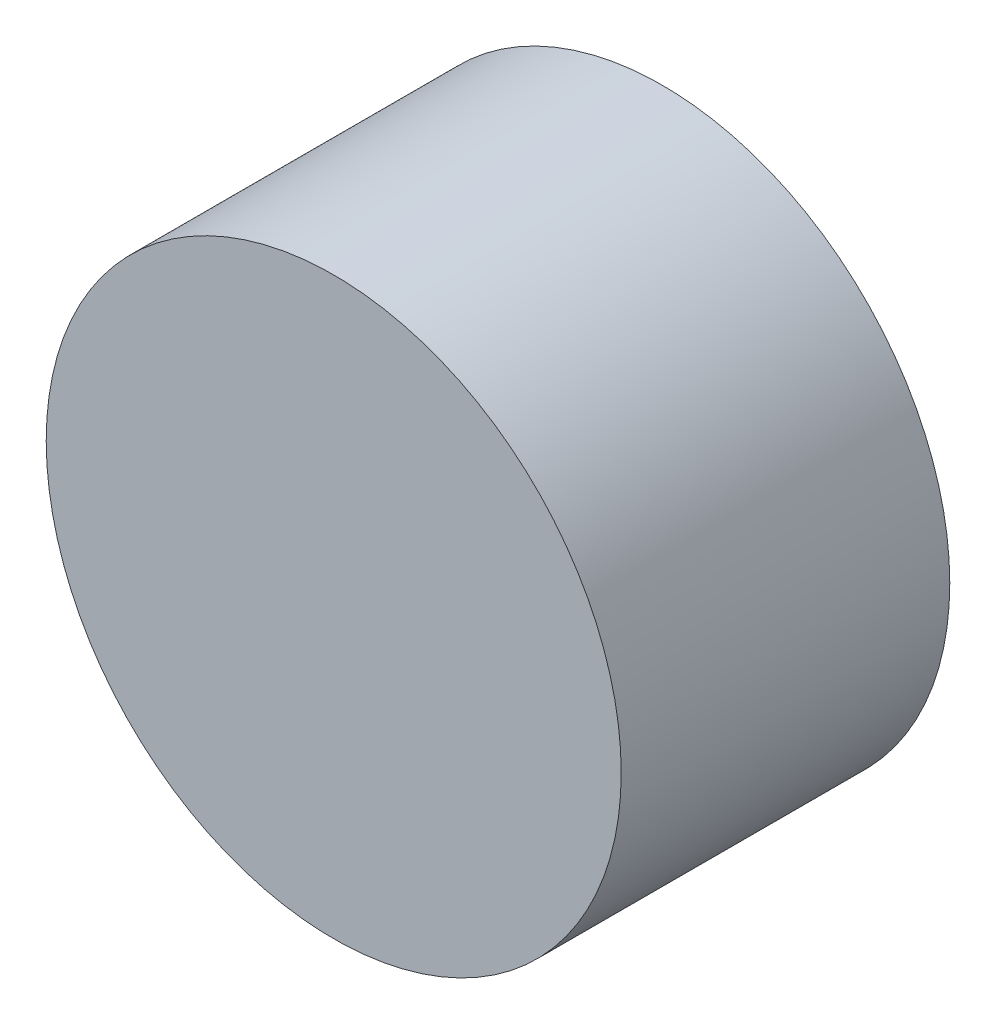
ISO-10303-21;
HEADER;
FILE_DESCRIPTION(('STEP AP214'),'2;1');
FILE_NAME('part.step','',(''),(''),'','','');
FILE_SCHEMA(('AUTOMOTIVE_DESIGN { 1 0 10303 214 1 1 1 1 }'));
ENDSEC;
DATA;
#1=APPLICATION_CONTEXT('core data for automotive mechanical design processes');
#2=APPLICATION_PROTOCOL_DEFINITION('international standard','automotive_design',2000,#1);
#3=PRODUCT_CONTEXT('',#1,'mechanical');
#4=PRODUCT('Part','Part','',(#3));
#5=PRODUCT_RELATED_PRODUCT_CATEGORY('part','',(#4));
#6=PRODUCT_DEFINITION_FORMATION('','',#4);
#7=PRODUCT_DEFINITION_CONTEXT('part definition',#1,'design');
#8=PRODUCT_DEFINITION('design','',#6,#7);
#9=PRODUCT_DEFINITION_SHAPE('','',#8);
#10=(LENGTH_UNIT() NAMED_UNIT(*) SI_UNIT(.MILLI.,.METRE.));
#11=(NAMED_UNIT(*) PLANE_ANGLE_UNIT() SI_UNIT($,.RADIAN.));
#12=(NAMED_UNIT(*) SI_UNIT($,.STERADIAN.) SOLID_ANGLE_UNIT());
#13=UNCERTAINTY_MEASURE_WITH_UNIT(LENGTH_MEASURE(1.E-05),#10,'distance_accuracy_value','');
#14=(GEOMETRIC_REPRESENTATION_CONTEXT(3) GLOBAL_UNCERTAINTY_ASSIGNED_CONTEXT((#13)) GLOBAL_UNIT_ASSIGNED_CONTEXT((#10,
#11,#12)) REPRESENTATION_CONTEXT('',''));
#15=CARTESIAN_POINT('',(0.,0.,0.));
#16=DIRECTION('',(0.,0.,1.));
#17=DIRECTION('',(1.,0.,0.));
#18=AXIS2_PLACEMENT_3D('',#15,#16,#17);
#19=CARTESIAN_POINT('',(0.,0.,6.35));
#20=DIRECTION('',(0.,0.,-1.));
#21=DIRECTION('',(-1.,0.,0.));
#22=AXIS2_PLACEMENT_3D('',#19,#20,#21);
#23=CYLINDRICAL_SURFACE('',#22,5.55625);
#24=CARTESIAN_POINT('',(0.,0.,6.35));
#25=DIRECTION('',(0.,0.,1.));
#26=DIRECTION('',(1.,0.,0.));
#27=AXIS2_PLACEMENT_3D('',#24,#25,#26);
#28=CIRCLE('',#27,5.55625);
#29=CARTESIAN_POINT('',(5.55625,0.,6.35));
#30=VERTEX_POINT('',#29);
#31=EDGE_CURVE('E10',#30,#30,#28,.T.);
#32=ORIENTED_EDGE('',*,*,#31,.F.);
#33=EDGE_LOOP('',(#32));
#34=FACE_BOUND('',#33,.T.);
#35=CARTESIAN_POINT('',(0.,0.,0.));
#36=DIRECTION('',(0.,0.,1.));
#37=DIRECTION('',(1.,0.,0.));
#38=AXIS2_PLACEMENT_3D('',#35,#36,#37);
#39=CIRCLE('',#38,5.55625);
#40=CARTESIAN_POINT('',(5.55625,0.,0.));
#41=VERTEX_POINT('',#40);
#42=EDGE_CURVE('E40',#41,#41,#39,.T.);
#43=ORIENTED_EDGE('',*,*,#42,.T.);
#44=EDGE_LOOP('',(#43));
#45=FACE_BOUND('',#44,.T.);
#46=ADVANCED_FACE('F37',(#34,#45),#23,.T.);
#47=CARTESIAN_POINT('',(0.,0.,6.35));
#48=DIRECTION('',(0.,0.,1.));
#49=DIRECTION('',(1.,0.,0.));
#50=AXIS2_PLACEMENT_3D('',#47,#48,#49);
#51=PLANE('',#50);
#52=ORIENTED_EDGE('',*,*,#31,.T.);
#53=EDGE_LOOP('',(#52));
#54=FACE_BOUND('',#53,.T.);
#55=ADVANCED_FACE('F54',(#54),#51,.T.);
#56=CARTESIAN_POINT('',(0.,0.,0.));
#57=DIRECTION('',(0.,0.,1.));
#58=DIRECTION('',(1.,0.,0.));
#59=AXIS2_PLACEMENT_3D('',#56,#57,#58);
#60=PLANE('',#59);
#61=ORIENTED_EDGE('',*,*,#42,.F.);
#62=EDGE_LOOP('',(#61));
#63=FACE_BOUND('',#62,.T.);
#64=ADVANCED_FACE('F52',(#63),#60,.F.);
#65=CLOSED_SHELL('',(#46,#55,#64));
#66=MANIFOLD_SOLID_BREP('B2',#65);
#67=ADVANCED_BREP_SHAPE_REPRESENTATION('',(#18,#66),#14);
#68=SHAPE_DEFINITION_REPRESENTATION(#9,#67);
ENDSEC;
END-ISO-10303-21;
